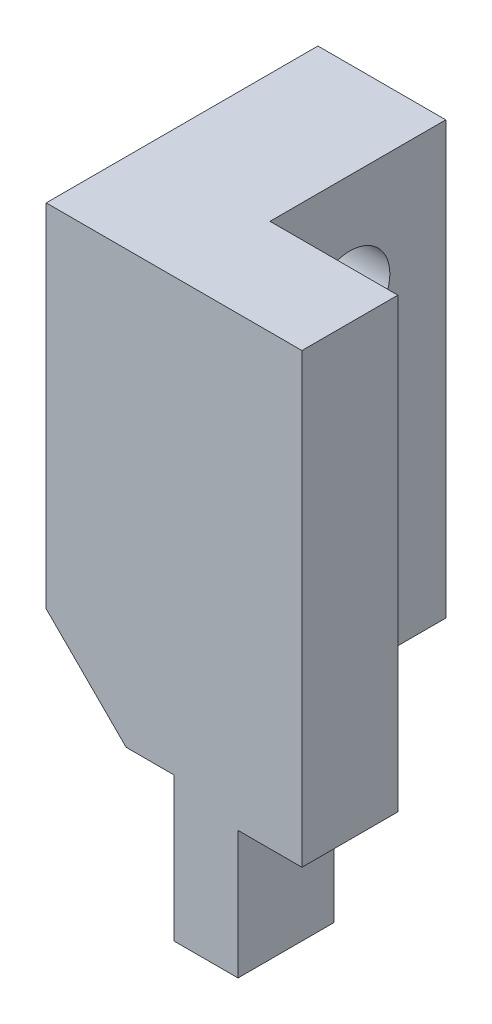
ISO-10303-21;
HEADER;
FILE_DESCRIPTION(('STEP AP214'),'2;1');
FILE_NAME('part.step','',(''),(''),'','','');
FILE_SCHEMA(('AUTOMOTIVE_DESIGN { 1 0 10303 214 1 1 1 1 }'));
ENDSEC;
DATA;
#1=APPLICATION_CONTEXT('core data for automotive mechanical design processes');
#2=APPLICATION_PROTOCOL_DEFINITION('international standard','automotive_design',2000,#1);
#3=PRODUCT_CONTEXT('',#1,'mechanical');
#4=PRODUCT('Part','Part','',(#3));
#5=PRODUCT_RELATED_PRODUCT_CATEGORY('part','',(#4));
#6=PRODUCT_DEFINITION_FORMATION('','',#4);
#7=PRODUCT_DEFINITION_CONTEXT('part definition',#1,'design');
#8=PRODUCT_DEFINITION('design','',#6,#7);
#9=PRODUCT_DEFINITION_SHAPE('','',#8);
#10=(LENGTH_UNIT() NAMED_UNIT(*) SI_UNIT(.MILLI.,.METRE.));
#11=(NAMED_UNIT(*) PLANE_ANGLE_UNIT() SI_UNIT($,.RADIAN.));
#12=(NAMED_UNIT(*) SI_UNIT($,.STERADIAN.) SOLID_ANGLE_UNIT());
#13=UNCERTAINTY_MEASURE_WITH_UNIT(LENGTH_MEASURE(1.E-05),#10,'distance_accuracy_value','');
#14=(GEOMETRIC_REPRESENTATION_CONTEXT(3) GLOBAL_UNCERTAINTY_ASSIGNED_CONTEXT((#13)) GLOBAL_UNIT_ASSIGNED_CONTEXT((#10,
#11,#12)) REPRESENTATION_CONTEXT('',''));
#15=CARTESIAN_POINT('',(0.,0.,0.));
#16=DIRECTION('',(0.,0.,1.));
#17=DIRECTION('',(1.,0.,0.));
#18=AXIS2_PLACEMENT_3D('',#15,#16,#17);
#19=CARTESIAN_POINT('',(0.,0.,8.5));
#20=DIRECTION('',(1.,0.,0.));
#21=DIRECTION('',(0.,0.,-1.));
#22=AXIS2_PLACEMENT_3D('',#19,#20,#21);
#23=PLANE('',#22);
#24=CARTESIAN_POINT('',(0.,14.7,2.99999999999994));
#25=DIRECTION('',(1.,0.,0.));
#26=DIRECTION('',(0.,0.,-1.));
#27=AXIS2_PLACEMENT_3D('',#24,#25,#26);
#28=CIRCLE('',#27,1.25);
#29=CARTESIAN_POINT('',(0.,14.7,1.74999999999994));
#30=VERTEX_POINT('',#29);
#31=EDGE_CURVE('E264',#30,#30,#28,.T.);
#32=ORIENTED_EDGE('',*,*,#31,.T.);
#33=EDGE_LOOP('',(#32));
#34=FACE_BOUND('',#33,.T.);
#35=CARTESIAN_POINT('',(0.,8.99999999999999,3.00000000000005));
#36=DIRECTION('',(1.,0.,0.));
#37=DIRECTION('',(0.,0.,-1.));
#38=AXIS2_PLACEMENT_3D('',#35,#36,#37);
#39=CIRCLE('',#38,1.25);
#40=CARTESIAN_POINT('',(0.,8.99999999999999,1.75000000000005));
#41=VERTEX_POINT('',#40);
#42=EDGE_CURVE('E126',#41,#41,#39,.T.);
#43=ORIENTED_EDGE('',*,*,#42,.T.);
#44=EDGE_LOOP('',(#43));
#45=FACE_BOUND('',#44,.T.);
#46=DIRECTION('',(0.,-1.,0.));
#47=VECTOR('',#46,1.);
#48=CARTESIAN_POINT('',(0.,0.,0.));
#49=LINE('',#48,#47);
#50=CARTESIAN_POINT('',(0.,18.,0.));
#51=VERTEX_POINT('',#50);
#52=CARTESIAN_POINT('',(0.,7.00000000000001,0.));
#53=VERTEX_POINT('',#52);
#54=EDGE_CURVE('E162',#51,#53,#49,.T.);
#55=ORIENTED_EDGE('',*,*,#54,.T.);
#56=DIRECTION('',(0.,0.,1.));
#57=VECTOR('',#56,1.);
#58=CARTESIAN_POINT('',(0.,7.,8.5));
#59=LINE('',#58,#57);
#60=CARTESIAN_POINT('',(0.,7.,8.5));
#61=VERTEX_POINT('',#60);
#62=EDGE_CURVE('E187',#53,#61,#59,.T.);
#63=ORIENTED_EDGE('',*,*,#62,.T.);
#64=DIRECTION('',(0.,-1.,0.));
#65=VECTOR('',#64,1.);
#66=CARTESIAN_POINT('',(0.,0.,8.5));
#67=LINE('',#66,#65);
#68=CARTESIAN_POINT('',(0.,18.,8.5));
#69=VERTEX_POINT('',#68);
#70=EDGE_CURVE('E166',#69,#61,#67,.T.);
#71=ORIENTED_EDGE('',*,*,#70,.F.);
#72=DIRECTION('',(0.,0.,-1.));
#73=VECTOR('',#72,1.);
#74=CARTESIAN_POINT('',(0.,18.,8.5));
#75=LINE('',#74,#73);
#76=EDGE_CURVE('E175',#69,#51,#75,.T.);
#77=ORIENTED_EDGE('',*,*,#76,.T.);
#78=EDGE_LOOP('',(#55,#63,#71,#77));
#79=FACE_BOUND('',#78,.T.);
#80=ADVANCED_FACE('F33',(#34,#45,#79),#23,.F.);
#81=CARTESIAN_POINT('',(0.,0.,8.5));
#82=DIRECTION('',(0.,1.,0.));
#83=DIRECTION('',(0.,0.,1.));
#84=AXIS2_PLACEMENT_3D('',#81,#82,#83);
#85=PLANE('',#84);
#86=DIRECTION('',(1.,0.,0.));
#87=VECTOR('',#86,1.);
#88=CARTESIAN_POINT('',(0.,0.,8.5));
#89=LINE('',#88,#87);
#90=CARTESIAN_POINT('',(4.,0.,8.5));
#91=VERTEX_POINT('',#90);
#92=CARTESIAN_POINT('',(6.,0.,8.5));
#93=VERTEX_POINT('',#92);
#94=EDGE_CURVE('E168',#91,#93,#89,.T.);
#95=ORIENTED_EDGE('',*,*,#94,.F.);
#96=DIRECTION('',(0.,0.,1.));
#97=VECTOR('',#96,1.);
#98=CARTESIAN_POINT('',(4.,0.,0.));
#99=LINE('',#98,#97);
#100=CARTESIAN_POINT('',(4.,0.,5.5));
#101=VERTEX_POINT('',#100);
#102=EDGE_CURVE('E124',#101,#91,#99,.T.);
#103=ORIENTED_EDGE('',*,*,#102,.F.);
#104=DIRECTION('',(1.,0.,0.));
#105=VECTOR('',#104,1.);
#106=CARTESIAN_POINT('',(4.,0.,5.5));
#107=LINE('',#106,#105);
#108=CARTESIAN_POINT('',(6.,0.,5.5));
#109=VERTEX_POINT('',#108);
#110=EDGE_CURVE('E134',#101,#109,#107,.T.);
#111=ORIENTED_EDGE('',*,*,#110,.T.);
#112=DIRECTION('',(0.,0.,1.));
#113=VECTOR('',#112,1.);
#114=CARTESIAN_POINT('',(6.,0.,0.));
#115=LINE('',#114,#113);
#116=EDGE_CURVE('E159',#109,#93,#115,.T.);
#117=ORIENTED_EDGE('',*,*,#116,.T.);
#118=EDGE_LOOP('',(#95,#103,#111,#117));
#119=FACE_BOUND('',#118,.T.);
#120=ADVANCED_FACE('F220',(#119),#85,.F.);
#121=CARTESIAN_POINT('',(8.,0.,8.5));
#122=DIRECTION('',(-1.,0.,0.));
#123=DIRECTION('',(0.,0.,1.));
#124=AXIS2_PLACEMENT_3D('',#121,#122,#123);
#125=PLANE('',#124);
#126=DIRECTION('',(0.,0.,1.));
#127=VECTOR('',#126,1.);
#128=CARTESIAN_POINT('',(8.,4.,0.));
#129=LINE('',#128,#127);
#130=CARTESIAN_POINT('',(8.,4.,5.5));
#131=VERTEX_POINT('',#130);
#132=CARTESIAN_POINT('',(8.,4.,8.5));
#133=VERTEX_POINT('',#132);
#134=EDGE_CURVE('E158',#131,#133,#129,.T.);
#135=ORIENTED_EDGE('',*,*,#134,.F.);
#136=DIRECTION('',(0.,1.,0.));
#137=VECTOR('',#136,1.);
#138=CARTESIAN_POINT('',(8.,0.,5.5));
#139=LINE('',#138,#137);
#140=CARTESIAN_POINT('',(8.,18.,5.5));
#141=VERTEX_POINT('',#140);
#142=EDGE_CURVE('E144',#131,#141,#139,.T.);
#143=ORIENTED_EDGE('',*,*,#142,.T.);
#144=DIRECTION('',(0.,0.,-1.));
#145=VECTOR('',#144,1.);
#146=CARTESIAN_POINT('',(8.,18.,8.5));
#147=LINE('',#146,#145);
#148=CARTESIAN_POINT('',(8.,18.,8.5));
#149=VERTEX_POINT('',#148);
#150=EDGE_CURVE('E181',#149,#141,#147,.T.);
#151=ORIENTED_EDGE('',*,*,#150,.F.);
#152=DIRECTION('',(0.,1.,0.));
#153=VECTOR('',#152,1.);
#154=CARTESIAN_POINT('',(8.,0.,8.5));
#155=LINE('',#154,#153);
#156=EDGE_CURVE('E171',#133,#149,#155,.T.);
#157=ORIENTED_EDGE('',*,*,#156,.F.);
#158=EDGE_LOOP('',(#135,#143,#151,#157));
#159=FACE_BOUND('',#158,.T.);
#160=ADVANCED_FACE('F225',(#159),#125,.F.);
#161=CARTESIAN_POINT('',(0.,18.,8.5));
#162=DIRECTION('',(0.,-1.,0.));
#163=DIRECTION('',(0.,0.,-1.));
#164=AXIS2_PLACEMENT_3D('',#161,#162,#163);
#165=PLANE('',#164);
#166=DIRECTION('',(1.,0.,0.));
#167=VECTOR('',#166,1.);
#168=CARTESIAN_POINT('',(4.,18.,5.5));
#169=LINE('',#168,#167);
#170=CARTESIAN_POINT('',(4.,18.,5.5));
#171=VERTEX_POINT('',#170);
#172=EDGE_CURVE('E137',#171,#141,#169,.T.);
#173=ORIENTED_EDGE('',*,*,#172,.F.);
#174=DIRECTION('',(0.,0.,1.));
#175=VECTOR('',#174,1.);
#176=CARTESIAN_POINT('',(4.,18.,0.));
#177=LINE('',#176,#175);
#178=CARTESIAN_POINT('',(4.,18.,0.));
#179=VERTEX_POINT('',#178);
#180=EDGE_CURVE('E132',#179,#171,#177,.T.);
#181=ORIENTED_EDGE('',*,*,#180,.F.);
#182=DIRECTION('',(-1.,0.,0.));
#183=VECTOR('',#182,1.);
#184=CARTESIAN_POINT('',(0.,18.,0.));
#185=LINE('',#184,#183);
#186=EDGE_CURVE('E169',#179,#51,#185,.T.);
#187=ORIENTED_EDGE('',*,*,#186,.T.);
#188=ORIENTED_EDGE('',*,*,#76,.F.);
#189=DIRECTION('',(-1.,0.,0.));
#190=VECTOR('',#189,1.);
#191=CARTESIAN_POINT('',(0.,18.,8.5));
#192=LINE('',#191,#190);
#193=EDGE_CURVE('E173',#149,#69,#192,.T.);
#194=ORIENTED_EDGE('',*,*,#193,.F.);
#195=ORIENTED_EDGE('',*,*,#150,.T.);
#196=EDGE_LOOP('',(#173,#181,#187,#188,#194,#195));
#197=FACE_BOUND('',#196,.T.);
#198=ADVANCED_FACE('F203',(#197),#165,.F.);
#199=CARTESIAN_POINT('',(0.,18.,8.5));
#200=DIRECTION('',(0.,0.,-1.));
#201=DIRECTION('',(-1.,0.,0.));
#202=AXIS2_PLACEMENT_3D('',#199,#200,#201);
#203=PLANE('',#202);
#204=ORIENTED_EDGE('',*,*,#70,.T.);
#205=DIRECTION('',(-0.707106781186548,0.707106781186547,0.));
#206=VECTOR('',#205,1.);
#207=CARTESIAN_POINT('',(0.,7.,8.5));
#208=LINE('',#207,#206);
#209=CARTESIAN_POINT('',(2.50000000000001,4.5,8.5));
#210=VERTEX_POINT('',#209);
#211=EDGE_CURVE('E55',#61,#210,#208,.F.);
#212=ORIENTED_EDGE('',*,*,#211,.T.);
#213=DIRECTION('',(-1.,0.,0.));
#214=VECTOR('',#213,1.);
#215=CARTESIAN_POINT('',(4.,4.5,8.5));
#216=LINE('',#215,#214);
#217=CARTESIAN_POINT('',(4.,4.5,8.5));
#218=VERTEX_POINT('',#217);
#219=EDGE_CURVE('E113',#218,#210,#216,.T.);
#220=ORIENTED_EDGE('',*,*,#219,.F.);
#221=DIRECTION('',(0.,1.,0.));
#222=VECTOR('',#221,1.);
#223=CARTESIAN_POINT('',(4.,0.,8.5));
#224=LINE('',#223,#222);
#225=EDGE_CURVE('E121',#91,#218,#224,.T.);
#226=ORIENTED_EDGE('',*,*,#225,.F.);
#227=ORIENTED_EDGE('',*,*,#94,.T.);
#228=DIRECTION('',(0.,-1.,0.));
#229=VECTOR('',#228,1.);
#230=CARTESIAN_POINT('',(6.,0.,8.5));
#231=LINE('',#230,#229);
#232=CARTESIAN_POINT('',(6.,4.,8.5));
#233=VERTEX_POINT('',#232);
#234=EDGE_CURVE('E155',#233,#93,#231,.T.);
#235=ORIENTED_EDGE('',*,*,#234,.F.);
#236=DIRECTION('',(-1.,0.,0.));
#237=VECTOR('',#236,1.);
#238=CARTESIAN_POINT('',(8.,4.,8.5));
#239=LINE('',#238,#237);
#240=EDGE_CURVE('E152',#133,#233,#239,.T.);
#241=ORIENTED_EDGE('',*,*,#240,.F.);
#242=ORIENTED_EDGE('',*,*,#156,.T.);
#243=ORIENTED_EDGE('',*,*,#193,.T.);
#244=EDGE_LOOP('',(#204,#212,#220,#226,#227,#235,#241,#242,#243));
#245=FACE_BOUND('',#244,.T.);
#246=ADVANCED_FACE('F128',(#245),#203,.F.);
#247=CARTESIAN_POINT('',(0.,18.,0.));
#248=DIRECTION('',(0.,0.,-1.));
#249=DIRECTION('',(-1.,0.,0.));
#250=AXIS2_PLACEMENT_3D('',#247,#248,#249);
#251=PLANE('',#250);
#252=DIRECTION('',(-1.,0.,0.));
#253=VECTOR('',#252,1.);
#254=CARTESIAN_POINT('',(4.,4.5,0.));
#255=LINE('',#254,#253);
#256=CARTESIAN_POINT('',(4.,4.5,0.));
#257=VERTEX_POINT('',#256);
#258=CARTESIAN_POINT('',(2.50000000000001,4.5,0.));
#259=VERTEX_POINT('',#258);
#260=EDGE_CURVE('E118',#257,#259,#255,.T.);
#261=ORIENTED_EDGE('',*,*,#260,.T.);
#262=DIRECTION('',(0.707106781186548,-0.707106781186547,0.));
#263=VECTOR('',#262,1.);
#264=CARTESIAN_POINT('',(-5.5,12.5,0.));
#265=LINE('',#264,#263);
#266=EDGE_CURVE('E11',#259,#53,#265,.F.);
#267=ORIENTED_EDGE('',*,*,#266,.T.);
#268=ORIENTED_EDGE('',*,*,#54,.F.);
#269=ORIENTED_EDGE('',*,*,#186,.F.);
#270=DIRECTION('',(0.,1.,0.));
#271=VECTOR('',#270,1.);
#272=CARTESIAN_POINT('',(4.,0.,0.));
#273=LINE('',#272,#271);
#274=EDGE_CURVE('E141',#257,#179,#273,.T.);
#275=ORIENTED_EDGE('',*,*,#274,.F.);
#276=EDGE_LOOP('',(#261,#267,#268,#269,#275));
#277=FACE_BOUND('',#276,.T.);
#278=ADVANCED_FACE('F207',(#277),#251,.T.);
#279=CARTESIAN_POINT('',(6.,0.,0.));
#280=DIRECTION('',(-1.,0.,0.));
#281=DIRECTION('',(0.,0.,1.));
#282=AXIS2_PLACEMENT_3D('',#279,#280,#281);
#283=PLANE('',#282);
#284=ORIENTED_EDGE('',*,*,#116,.F.);
#285=DIRECTION('',(0.,1.,0.));
#286=VECTOR('',#285,1.);
#287=CARTESIAN_POINT('',(6.,0.,5.5));
#288=LINE('',#287,#286);
#289=CARTESIAN_POINT('',(6.,4.,5.5));
#290=VERTEX_POINT('',#289);
#291=EDGE_CURVE('E143',#109,#290,#288,.T.);
#292=ORIENTED_EDGE('',*,*,#291,.T.);
#293=DIRECTION('',(0.,0.,1.));
#294=VECTOR('',#293,1.);
#295=CARTESIAN_POINT('',(6.,4.,0.));
#296=LINE('',#295,#294);
#297=EDGE_CURVE('E163',#290,#233,#296,.T.);
#298=ORIENTED_EDGE('',*,*,#297,.T.);
#299=ORIENTED_EDGE('',*,*,#234,.T.);
#300=EDGE_LOOP('',(#284,#292,#298,#299));
#301=FACE_BOUND('',#300,.T.);
#302=ADVANCED_FACE('F238',(#301),#283,.F.);
#303=CARTESIAN_POINT('',(8.,4.,0.));
#304=DIRECTION('',(0.,1.,0.));
#305=DIRECTION('',(0.,0.,1.));
#306=AXIS2_PLACEMENT_3D('',#303,#304,#305);
#307=PLANE('',#306);
#308=ORIENTED_EDGE('',*,*,#297,.F.);
#309=DIRECTION('',(1.,0.,0.));
#310=VECTOR('',#309,1.);
#311=CARTESIAN_POINT('',(8.,4.,5.5));
#312=LINE('',#311,#310);
#313=EDGE_CURVE('E184',#290,#131,#312,.T.);
#314=ORIENTED_EDGE('',*,*,#313,.T.);
#315=ORIENTED_EDGE('',*,*,#134,.T.);
#316=ORIENTED_EDGE('',*,*,#240,.T.);
#317=EDGE_LOOP('',(#308,#314,#315,#316));
#318=FACE_BOUND('',#317,.T.);
#319=ADVANCED_FACE('F241',(#318),#307,.F.);
#320=CARTESIAN_POINT('',(4.,0.,5.5));
#321=DIRECTION('',(0.,0.,1.));
#322=DIRECTION('',(1.,0.,0.));
#323=AXIS2_PLACEMENT_3D('',#320,#321,#322);
#324=PLANE('',#323);
#325=ORIENTED_EDGE('',*,*,#110,.F.);
#326=DIRECTION('',(0.,1.,0.));
#327=VECTOR('',#326,1.);
#328=CARTESIAN_POINT('',(4.,0.,5.5));
#329=LINE('',#328,#327);
#330=CARTESIAN_POINT('',(4.,4.5,5.5));
#331=VERTEX_POINT('',#330);
#332=EDGE_CURVE('E147',#101,#331,#329,.T.);
#333=ORIENTED_EDGE('',*,*,#332,.T.);
#334=EDGE_CURVE('E136',#331,#171,#329,.T.);
#335=ORIENTED_EDGE('',*,*,#334,.T.);
#336=ORIENTED_EDGE('',*,*,#172,.T.);
#337=ORIENTED_EDGE('',*,*,#142,.F.);
#338=ORIENTED_EDGE('',*,*,#313,.F.);
#339=ORIENTED_EDGE('',*,*,#291,.F.);
#340=EDGE_LOOP('',(#325,#333,#335,#336,#337,#338,#339));
#341=FACE_BOUND('',#340,.T.);
#342=ADVANCED_FACE('F244',(#341),#324,.F.);
#343=CARTESIAN_POINT('',(4.,0.,0.));
#344=DIRECTION('',(-1.,0.,0.));
#345=DIRECTION('',(0.,0.,1.));
#346=AXIS2_PLACEMENT_3D('',#343,#344,#345);
#347=PLANE('',#346);
#348=CARTESIAN_POINT('',(4.,14.7,2.99999999999994));
#349=DIRECTION('',(1.,0.,0.));
#350=DIRECTION('',(0.,0.,-1.));
#351=AXIS2_PLACEMENT_3D('',#348,#349,#350);
#352=CIRCLE('',#351,1.24999999999999);
#353=CARTESIAN_POINT('',(4.,14.7,1.74999999999995));
#354=VERTEX_POINT('',#353);
#355=EDGE_CURVE('E267',#354,#354,#352,.T.);
#356=ORIENTED_EDGE('',*,*,#355,.F.);
#357=EDGE_LOOP('',(#356));
#358=FACE_BOUND('',#357,.T.);
#359=CARTESIAN_POINT('',(4.,8.99999999999999,3.00000000000005));
#360=DIRECTION('',(1.,0.,0.));
#361=DIRECTION('',(0.,0.,-1.));
#362=AXIS2_PLACEMENT_3D('',#359,#360,#361);
#363=CIRCLE('',#362,1.24999999999999);
#364=CARTESIAN_POINT('',(4.,8.99999999999999,1.75000000000006));
#365=VERTEX_POINT('',#364);
#366=EDGE_CURVE('E269',#365,#365,#363,.T.);
#367=ORIENTED_EDGE('',*,*,#366,.F.);
#368=EDGE_LOOP('',(#367));
#369=FACE_BOUND('',#368,.T.);
#370=ORIENTED_EDGE('',*,*,#334,.F.);
#371=DIRECTION('',(0.,0.,1.));
#372=VECTOR('',#371,1.);
#373=CARTESIAN_POINT('',(4.,4.5,0.));
#374=LINE('',#373,#372);
#375=EDGE_CURVE('E115',#257,#331,#374,.T.);
#376=ORIENTED_EDGE('',*,*,#375,.F.);
#377=ORIENTED_EDGE('',*,*,#274,.T.);
#378=ORIENTED_EDGE('',*,*,#180,.T.);
#379=EDGE_LOOP('',(#370,#376,#377,#378));
#380=FACE_BOUND('',#379,.T.);
#381=ADVANCED_FACE('F249',(#358,#369,#380),#347,.F.);
#382=CARTESIAN_POINT('',(4.,0.,0.));
#383=DIRECTION('',(1.,0.,0.));
#384=DIRECTION('',(0.,0.,-1.));
#385=AXIS2_PLACEMENT_3D('',#382,#383,#384);
#386=PLANE('',#385);
#387=ORIENTED_EDGE('',*,*,#102,.T.);
#388=ORIENTED_EDGE('',*,*,#225,.T.);
#389=EDGE_CURVE('E110',#331,#218,#374,.T.);
#390=ORIENTED_EDGE('',*,*,#389,.F.);
#391=ORIENTED_EDGE('',*,*,#332,.F.);
#392=EDGE_LOOP('',(#387,#388,#390,#391));
#393=FACE_BOUND('',#392,.T.);
#394=ADVANCED_FACE('F122',(#393),#386,.F.);
#395=CARTESIAN_POINT('',(4.,4.5,0.));
#396=DIRECTION('',(0.,1.,0.));
#397=DIRECTION('',(-1.,0.,0.));
#398=AXIS2_PLACEMENT_3D('',#395,#396,#397);
#399=PLANE('',#398);
#400=ORIENTED_EDGE('',*,*,#219,.T.);
#401=DIRECTION('',(0.,0.,-1.));
#402=VECTOR('',#401,1.);
#403=CARTESIAN_POINT('',(2.50000000000001,4.5,0.));
#404=LINE('',#403,#402);
#405=EDGE_CURVE('E41',#210,#259,#404,.T.);
#406=ORIENTED_EDGE('',*,*,#405,.T.);
#407=ORIENTED_EDGE('',*,*,#260,.F.);
#408=ORIENTED_EDGE('',*,*,#375,.T.);
#409=ORIENTED_EDGE('',*,*,#389,.T.);
#410=EDGE_LOOP('',(#400,#406,#407,#408,#409));
#411=FACE_BOUND('',#410,.T.);
#412=ADVANCED_FACE('F112',(#411),#399,.F.);
#413=CARTESIAN_POINT('',(0.,7.,8.5));
#414=DIRECTION('',(0.707106781186547,0.707106781186548,0.));
#415=DIRECTION('',(-0.707106781186548,0.707106781186547,0.));
#416=AXIS2_PLACEMENT_3D('',#413,#414,#415);
#417=PLANE('',#416);
#418=ORIENTED_EDGE('',*,*,#266,.F.);
#419=ORIENTED_EDGE('',*,*,#405,.F.);
#420=ORIENTED_EDGE('',*,*,#211,.F.);
#421=ORIENTED_EDGE('',*,*,#62,.F.);
#422=EDGE_LOOP('',(#418,#419,#420,#421));
#423=FACE_BOUND('',#422,.T.);
#424=ADVANCED_FACE('F35',(#423),#417,.F.);
#425=CARTESIAN_POINT('',(4.,8.99999999999999,3.00000000000005));
#426=DIRECTION('',(1.,0.,0.));
#427=DIRECTION('',(0.,0.,-1.));
#428=AXIS2_PLACEMENT_3D('',#425,#426,#427);
#429=CYLINDRICAL_SURFACE('',#428,1.24999999999999);
#430=ORIENTED_EDGE('',*,*,#42,.F.);
#431=EDGE_LOOP('',(#430));
#432=FACE_BOUND('',#431,.T.);
#433=ORIENTED_EDGE('',*,*,#366,.T.);
#434=EDGE_LOOP('',(#433));
#435=FACE_BOUND('',#434,.T.);
#436=ADVANCED_FACE('F210',(#432,#435),#429,.F.);
#437=CARTESIAN_POINT('',(4.,14.7,2.99999999999994));
#438=DIRECTION('',(1.,0.,0.));
#439=DIRECTION('',(0.,0.,-1.));
#440=AXIS2_PLACEMENT_3D('',#437,#438,#439);
#441=CYLINDRICAL_SURFACE('',#440,1.24999999999999);
#442=ORIENTED_EDGE('',*,*,#31,.F.);
#443=EDGE_LOOP('',(#442));
#444=FACE_BOUND('',#443,.T.);
#445=ORIENTED_EDGE('',*,*,#355,.T.);
#446=EDGE_LOOP('',(#445));
#447=FACE_BOUND('',#446,.T.);
#448=ADVANCED_FACE('F215',(#444,#447),#441,.F.);
#449=CLOSED_SHELL('',(#80,#120,#160,#198,#246,#278,#302,#319,#342,#381,#394,#412,#424,#436,#448));
#450=MANIFOLD_SOLID_BREP('B2',#449);
#451=ADVANCED_BREP_SHAPE_REPRESENTATION('',(#18,#450),#14);
#452=SHAPE_DEFINITION_REPRESENTATION(#9,#451);
ENDSEC;
END-ISO-10303-21;
